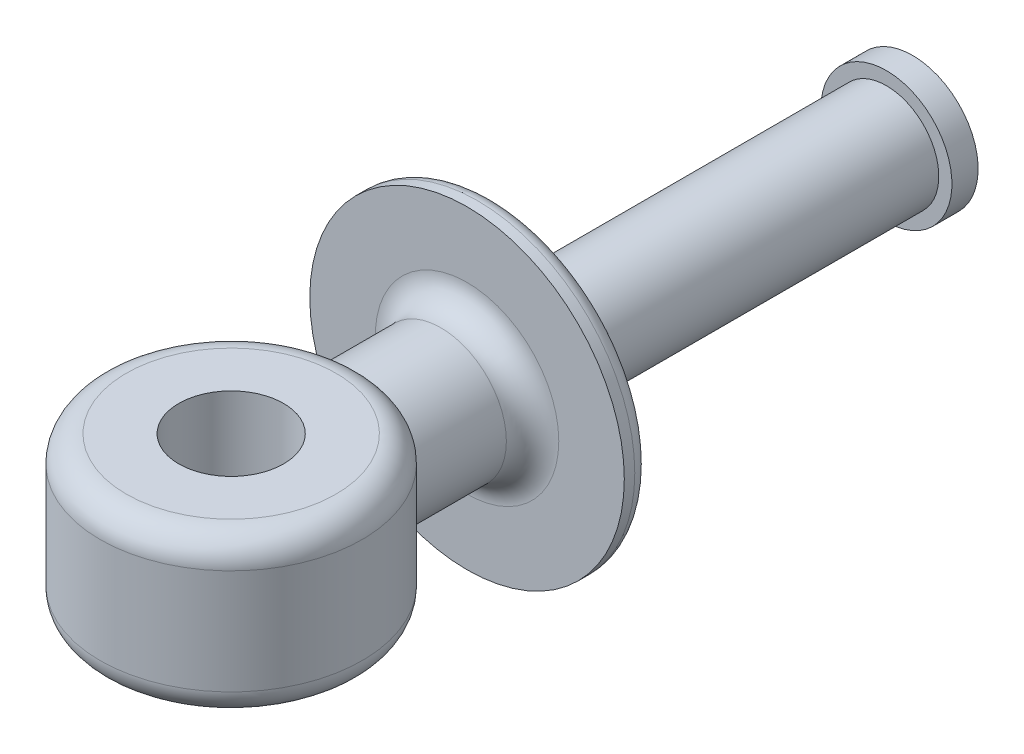
ISO-10303-21;
HEADER;
FILE_DESCRIPTION(('STEP AP214'),'2;1');
FILE_NAME('part.step','',(''),(''),'','','');
FILE_SCHEMA(('AUTOMOTIVE_DESIGN { 1 0 10303 214 1 1 1 1 }'));
ENDSEC;
DATA;
#1=APPLICATION_CONTEXT('core data for automotive mechanical design processes');
#2=APPLICATION_PROTOCOL_DEFINITION('international standard','automotive_design',2000,#1);
#3=PRODUCT_CONTEXT('',#1,'mechanical');
#4=PRODUCT('Part','Part','',(#3));
#5=PRODUCT_RELATED_PRODUCT_CATEGORY('part','',(#4));
#6=PRODUCT_DEFINITION_FORMATION('','',#4);
#7=PRODUCT_DEFINITION_CONTEXT('part definition',#1,'design');
#8=PRODUCT_DEFINITION('design','',#6,#7);
#9=PRODUCT_DEFINITION_SHAPE('','',#8);
#10=(LENGTH_UNIT() NAMED_UNIT(*) SI_UNIT(.MILLI.,.METRE.));
#11=(NAMED_UNIT(*) PLANE_ANGLE_UNIT() SI_UNIT($,.RADIAN.));
#12=(NAMED_UNIT(*) SI_UNIT($,.STERADIAN.) SOLID_ANGLE_UNIT());
#13=UNCERTAINTY_MEASURE_WITH_UNIT(LENGTH_MEASURE(1.E-05),#10,'distance_accuracy_value','');
#14=(GEOMETRIC_REPRESENTATION_CONTEXT(3) GLOBAL_UNCERTAINTY_ASSIGNED_CONTEXT((#13)) GLOBAL_UNIT_ASSIGNED_CONTEXT((#10,
#11,#12)) REPRESENTATION_CONTEXT('',''));
#15=CARTESIAN_POINT('',(0.,0.,0.));
#16=DIRECTION('',(0.,0.,1.));
#17=DIRECTION('',(1.,0.,0.));
#18=AXIS2_PLACEMENT_3D('',#15,#16,#17);
#19=CARTESIAN_POINT('',(0.,0.,40.));
#20=DIRECTION('',(0.,0.,1.));
#21=DIRECTION('',(1.,0.,0.));
#22=AXIS2_PLACEMENT_3D('',#19,#20,#21);
#23=PLANE('',#22);
#24=CARTESIAN_POINT('',(0.,0.,40.));
#25=DIRECTION('',(0.,0.,1.));
#26=DIRECTION('',(1.,0.,0.));
#27=AXIS2_PLACEMENT_3D('',#24,#25,#26);
#28=CIRCLE('',#27,8.75);
#29=CARTESIAN_POINT('',(8.75,0.,40.));
#30=VERTEX_POINT('',#29);
#31=EDGE_CURVE('E54',#30,#30,#28,.F.);
#32=ORIENTED_EDGE('',*,*,#31,.T.);
#33=EDGE_LOOP('',(#32));
#34=FACE_BOUND('',#33,.T.);
#35=CARTESIAN_POINT('',(0.,0.,40.));
#36=DIRECTION('',(0.,0.,1.));
#37=DIRECTION('',(1.,0.,0.));
#38=AXIS2_PLACEMENT_3D('',#35,#36,#37);
#39=CIRCLE('',#38,15.);
#40=CARTESIAN_POINT('',(15.,0.,40.));
#41=VERTEX_POINT('',#40);
#42=EDGE_CURVE('E73',#41,#41,#39,.T.);
#43=ORIENTED_EDGE('',*,*,#42,.T.);
#44=EDGE_LOOP('',(#43));
#45=FACE_BOUND('',#44,.T.);
#46=ADVANCED_FACE('F43',(#34,#45),#23,.T.);
#47=CARTESIAN_POINT('',(0.,0.,37.5));
#48=DIRECTION('',(0.,0.,-1.));
#49=DIRECTION('',(-1.,0.,0.));
#50=AXIS2_PLACEMENT_3D('',#47,#48,#49);
#51=CYLINDRICAL_SURFACE('',#50,5.);
#52=CARTESIAN_POINT('',(0.,0.,37.5));
#53=DIRECTION('',(0.,0.,1.));
#54=DIRECTION('',(1.,0.,0.));
#55=AXIS2_PLACEMENT_3D('',#52,#53,#54);
#56=CIRCLE('',#55,5.);
#57=CARTESIAN_POINT('',(5.,0.,37.5));
#58=VERTEX_POINT('',#57);
#59=EDGE_CURVE('E63',#58,#58,#56,.T.);
#60=ORIENTED_EDGE('',*,*,#59,.F.);
#61=EDGE_LOOP('',(#60));
#62=FACE_BOUND('',#61,.T.);
#63=CARTESIAN_POINT('',(0.,0.,0.));
#64=DIRECTION('',(0.,0.,-1.));
#65=DIRECTION('',(-1.,0.,0.));
#66=AXIS2_PLACEMENT_3D('',#63,#64,#65);
#67=CIRCLE('',#66,5.);
#68=CARTESIAN_POINT('',(-5.,0.,0.));
#69=VERTEX_POINT('',#68);
#70=EDGE_CURVE('E66',#69,#69,#67,.T.);
#71=ORIENTED_EDGE('',*,*,#70,.F.);
#72=EDGE_LOOP('',(#71));
#73=FACE_BOUND('',#72,.T.);
#74=ADVANCED_FACE('F99',(#62,#73),#51,.T.);
#75=CARTESIAN_POINT('',(0.,0.,0.));
#76=DIRECTION('',(0.,0.,-1.));
#77=DIRECTION('',(-1.,0.,0.));
#78=AXIS2_PLACEMENT_3D('',#75,#76,#77);
#79=PLANE('',#78);
#80=CARTESIAN_POINT('',(0.,0.,0.));
#81=DIRECTION('',(0.,0.,-1.));
#82=DIRECTION('',(-1.,0.,0.));
#83=AXIS2_PLACEMENT_3D('',#80,#81,#82);
#84=CIRCLE('',#83,6.25);
#85=CARTESIAN_POINT('',(-6.25,0.,0.));
#86=VERTEX_POINT('',#85);
#87=EDGE_CURVE('E70',#86,#86,#84,.T.);
#88=ORIENTED_EDGE('',*,*,#87,.F.);
#89=EDGE_LOOP('',(#88));
#90=FACE_BOUND('',#89,.T.);
#91=ORIENTED_EDGE('',*,*,#70,.T.);
#92=EDGE_LOOP('',(#91));
#93=FACE_BOUND('',#92,.T.);
#94=ADVANCED_FACE('F104',(#90,#93),#79,.F.);
#95=CARTESIAN_POINT('',(0.,0.,-2.5));
#96=DIRECTION('',(0.,0.,1.));
#97=DIRECTION('',(1.,0.,0.));
#98=AXIS2_PLACEMENT_3D('',#95,#96,#97);
#99=CYLINDRICAL_SURFACE('',#98,6.25);
#100=CARTESIAN_POINT('',(0.,0.,-2.5));
#101=DIRECTION('',(0.,0.,-1.));
#102=DIRECTION('',(-1.,0.,0.));
#103=AXIS2_PLACEMENT_3D('',#100,#101,#102);
#104=CIRCLE('',#103,6.25);
#105=CARTESIAN_POINT('',(-6.25,0.,-2.5));
#106=VERTEX_POINT('',#105);
#107=EDGE_CURVE('E69',#106,#106,#104,.T.);
#108=ORIENTED_EDGE('',*,*,#107,.F.);
#109=EDGE_LOOP('',(#108));
#110=FACE_BOUND('',#109,.T.);
#111=ORIENTED_EDGE('',*,*,#87,.T.);
#112=EDGE_LOOP('',(#111));
#113=FACE_BOUND('',#112,.T.);
#114=ADVANCED_FACE('F114',(#110,#113),#99,.T.);
#115=CARTESIAN_POINT('',(0.,0.,-2.5));
#116=DIRECTION('',(0.,0.,-1.));
#117=DIRECTION('',(-1.,0.,0.));
#118=AXIS2_PLACEMENT_3D('',#115,#116,#117);
#119=PLANE('',#118);
#120=ORIENTED_EDGE('',*,*,#107,.T.);
#121=EDGE_LOOP('',(#120));
#122=FACE_BOUND('',#121,.T.);
#123=ADVANCED_FACE('F110',(#122),#119,.T.);
#124=CARTESIAN_POINT('',(0.,0.,37.5));
#125=DIRECTION('',(0.,0.,1.));
#126=DIRECTION('',(1.,0.,0.));
#127=AXIS2_PLACEMENT_3D('',#124,#125,#126);
#128=PLANE('',#127);
#129=CARTESIAN_POINT('',(0.,0.,37.5));
#130=DIRECTION('',(0.,0.,1.));
#131=DIRECTION('',(1.,0.,0.));
#132=AXIS2_PLACEMENT_3D('',#129,#130,#131);
#133=CIRCLE('',#132,13.5);
#134=CARTESIAN_POINT('',(13.5,0.,37.5));
#135=VERTEX_POINT('',#134);
#136=EDGE_CURVE('E11',#135,#135,#133,.F.);
#137=ORIENTED_EDGE('',*,*,#136,.T.);
#138=EDGE_LOOP('',(#137));
#139=FACE_BOUND('',#138,.T.);
#140=ORIENTED_EDGE('',*,*,#59,.T.);
#141=EDGE_LOOP('',(#140));
#142=FACE_BOUND('',#141,.T.);
#143=ADVANCED_FACE('F95',(#139,#142),#128,.F.);
#144=CARTESIAN_POINT('',(0.,0.,40.));
#145=DIRECTION('',(0.,0.,-1.));
#146=DIRECTION('',(-1.,0.,0.));
#147=AXIS2_PLACEMENT_3D('',#144,#145,#146);
#148=CYLINDRICAL_SURFACE('',#147,15.);
#149=CARTESIAN_POINT('',(0.,0.,39.));
#150=DIRECTION('',(0.,0.,1.));
#151=DIRECTION('',(1.,0.,0.));
#152=AXIS2_PLACEMENT_3D('',#149,#150,#151);
#153=CIRCLE('',#152,15.);
#154=CARTESIAN_POINT('',(15.,0.,39.));
#155=VERTEX_POINT('',#154);
#156=EDGE_CURVE('E50',#155,#155,#153,.T.);
#157=ORIENTED_EDGE('',*,*,#156,.T.);
#158=EDGE_LOOP('',(#157));
#159=FACE_BOUND('',#158,.T.);
#160=ORIENTED_EDGE('',*,*,#42,.F.);
#161=EDGE_LOOP('',(#160));
#162=FACE_BOUND('',#161,.T.);
#163=ADVANCED_FACE('F86',(#159,#162),#148,.T.);
#164=CARTESIAN_POINT('',(0.,0.,55.));
#165=DIRECTION('',(0.,0.,-1.));
#166=DIRECTION('',(-1.,0.,0.));
#167=AXIS2_PLACEMENT_3D('',#164,#165,#166);
#168=CYLINDRICAL_SURFACE('',#167,6.25);
#169=CARTESIAN_POINT('',(0.,0.,42.5));
#170=DIRECTION('',(0.,0.,1.));
#171=DIRECTION('',(1.,0.,0.));
#172=AXIS2_PLACEMENT_3D('',#169,#170,#171);
#173=CIRCLE('',#172,6.25);
#174=CARTESIAN_POINT('',(6.25,0.,42.5));
#175=VERTEX_POINT('',#174);
#176=EDGE_CURVE('E58',#175,#175,#173,.T.);
#177=ORIENTED_EDGE('',*,*,#176,.T.);
#178=EDGE_LOOP('',(#177));
#179=FACE_BOUND('',#178,.T.);
#180=CARTESIAN_POINT('',(0.,0.,55.));
#181=DIRECTION('',(0.,0.,1.));
#182=DIRECTION('',(1.,0.,0.));
#183=AXIS2_PLACEMENT_3D('',#180,#181,#182);
#184=CIRCLE('',#183,6.25);
#185=CARTESIAN_POINT('',(6.25,0.,55.));
#186=VERTEX_POINT('',#185);
#187=EDGE_CURVE('E78',#186,#186,#184,.T.);
#188=ORIENTED_EDGE('',*,*,#187,.F.);
#189=EDGE_LOOP('',(#188));
#190=FACE_BOUND('',#189,.T.);
#191=ADVANCED_FACE('F84',(#179,#190),#168,.T.);
#192=CARTESIAN_POINT('',(0.,0.,55.));
#193=DIRECTION('',(0.,0.,1.));
#194=DIRECTION('',(1.,0.,0.));
#195=AXIS2_PLACEMENT_3D('',#192,#193,#194);
#196=PLANE('',#195);
#197=ORIENTED_EDGE('',*,*,#187,.T.);
#198=EDGE_LOOP('',(#197));
#199=FACE_BOUND('',#198,.T.);
#200=ADVANCED_FACE('F82',(#199),#196,.T.);
#201=CARTESIAN_POINT('',(0.,0.,42.5));
#202=DIRECTION('',(0.,0.,1.));
#203=DIRECTION('',(1.,0.,0.));
#204=AXIS2_PLACEMENT_3D('',#201,#202,#203);
#205=TOROIDAL_SURFACE('',#204,8.75,2.5);
#206=ORIENTED_EDGE('',*,*,#31,.F.);
#207=EDGE_LOOP('',(#206));
#208=FACE_BOUND('',#207,.T.);
#209=ORIENTED_EDGE('',*,*,#176,.F.);
#210=EDGE_LOOP('',(#209));
#211=FACE_BOUND('',#210,.T.);
#212=ADVANCED_FACE('F93',(#208,#211),#205,.F.);
#213=CARTESIAN_POINT('',(0.,0.,39.));
#214=DIRECTION('',(0.,0.,1.));
#215=DIRECTION('',(1.,0.,0.));
#216=AXIS2_PLACEMENT_3D('',#213,#214,#215);
#217=TOROIDAL_SURFACE('',#216,13.5,1.5);
#218=ORIENTED_EDGE('',*,*,#136,.F.);
#219=EDGE_LOOP('',(#218));
#220=FACE_BOUND('',#219,.T.);
#221=ORIENTED_EDGE('',*,*,#156,.F.);
#222=EDGE_LOOP('',(#221));
#223=FACE_BOUND('',#222,.T.);
#224=ADVANCED_FACE('F45',(#220,#223),#217,.T.);
#225=CLOSED_SHELL('',(#46,#74,#94,#114,#123,#143,#163,#191,#200,#212,#224));
#226=MANIFOLD_SOLID_BREP('B2',#225);
#227=CARTESIAN_POINT('',(0.,7.5,62.5));
#228=DIRECTION('',(0.,-1.,0.));
#229=DIRECTION('',(0.,0.,-1.));
#230=AXIS2_PLACEMENT_3D('',#227,#228,#229);
#231=CYLINDRICAL_SURFACE('',#230,12.5);
#232=CARTESIAN_POINT('',(0.,-5.,62.5));
#233=DIRECTION('',(0.,1.,0.));
#234=DIRECTION('',(0.,0.,1.));
#235=AXIS2_PLACEMENT_3D('',#232,#233,#234);
#236=CIRCLE('',#235,12.5);
#237=CARTESIAN_POINT('',(0.,-5.,75.));
#238=VERTEX_POINT('',#237);
#239=EDGE_CURVE('E233',#238,#238,#236,.T.);
#240=ORIENTED_EDGE('',*,*,#239,.T.);
#241=EDGE_LOOP('',(#240));
#242=FACE_BOUND('',#241,.T.);
#243=CARTESIAN_POINT('',(0.,5.,62.5));
#244=DIRECTION('',(0.,1.,0.));
#245=DIRECTION('',(0.,0.,1.));
#246=AXIS2_PLACEMENT_3D('',#243,#244,#245);
#247=CIRCLE('',#246,12.5);
#248=CARTESIAN_POINT('',(0.,5.,75.));
#249=VERTEX_POINT('',#248);
#250=EDGE_CURVE('E237',#249,#249,#247,.F.);
#251=ORIENTED_EDGE('',*,*,#250,.T.);
#252=EDGE_LOOP('',(#251));
#253=FACE_BOUND('',#252,.T.);
#254=ADVANCED_FACE('F222',(#242,#253),#231,.T.);
#255=CARTESIAN_POINT('',(0.,7.5,62.5));
#256=DIRECTION('',(0.,1.,0.));
#257=DIRECTION('',(0.,0.,1.));
#258=AXIS2_PLACEMENT_3D('',#255,#256,#257);
#259=PLANE('',#258);
#260=CARTESIAN_POINT('',(0.,7.5,62.5));
#261=DIRECTION('',(0.,1.,0.));
#262=DIRECTION('',(0.,0.,1.));
#263=AXIS2_PLACEMENT_3D('',#260,#261,#262);
#264=CIRCLE('',#263,10.);
#265=CARTESIAN_POINT('',(0.,7.5,72.5));
#266=VERTEX_POINT('',#265);
#267=EDGE_CURVE('E42',#266,#266,#264,.T.);
#268=ORIENTED_EDGE('',*,*,#267,.T.);
#269=EDGE_LOOP('',(#268));
#270=FACE_BOUND('',#269,.T.);
#271=CARTESIAN_POINT('',(0.,7.5,62.5));
#272=DIRECTION('',(0.,1.,0.));
#273=DIRECTION('',(0.,0.,1.));
#274=AXIS2_PLACEMENT_3D('',#271,#272,#273);
#275=CIRCLE('',#274,5.);
#276=CARTESIAN_POINT('',(0.,7.5,67.5));
#277=VERTEX_POINT('',#276);
#278=EDGE_CURVE('E245',#277,#277,#275,.T.);
#279=ORIENTED_EDGE('',*,*,#278,.F.);
#280=EDGE_LOOP('',(#279));
#281=FACE_BOUND('',#280,.T.);
#282=ADVANCED_FACE('F252',(#270,#281),#259,.T.);
#283=CARTESIAN_POINT('',(0.,-7.5,62.5));
#284=DIRECTION('',(0.,1.,0.));
#285=DIRECTION('',(0.,0.,1.));
#286=AXIS2_PLACEMENT_3D('',#283,#284,#285);
#287=PLANE('',#286);
#288=CARTESIAN_POINT('',(0.,-7.5,62.5));
#289=DIRECTION('',(0.,1.,0.));
#290=DIRECTION('',(0.,0.,1.));
#291=AXIS2_PLACEMENT_3D('',#288,#289,#290);
#292=CIRCLE('',#291,10.);
#293=CARTESIAN_POINT('',(0.,-7.5,72.5));
#294=VERTEX_POINT('',#293);
#295=EDGE_CURVE('E229',#294,#294,#292,.F.);
#296=ORIENTED_EDGE('',*,*,#295,.T.);
#297=EDGE_LOOP('',(#296));
#298=FACE_BOUND('',#297,.T.);
#299=CARTESIAN_POINT('',(0.,-7.5,62.5));
#300=DIRECTION('',(0.,1.,0.));
#301=DIRECTION('',(0.,0.,1.));
#302=AXIS2_PLACEMENT_3D('',#299,#300,#301);
#303=CIRCLE('',#302,5.);
#304=CARTESIAN_POINT('',(0.,-7.5,67.5));
#305=VERTEX_POINT('',#304);
#306=EDGE_CURVE('E242',#305,#305,#303,.T.);
#307=ORIENTED_EDGE('',*,*,#306,.T.);
#308=EDGE_LOOP('',(#307));
#309=FACE_BOUND('',#308,.T.);
#310=ADVANCED_FACE('F254',(#298,#309),#287,.F.);
#311=CARTESIAN_POINT('',(0.,-15.,62.5));
#312=DIRECTION('',(0.,1.,0.));
#313=DIRECTION('',(0.,0.,1.));
#314=AXIS2_PLACEMENT_3D('',#311,#312,#313);
#315=CYLINDRICAL_SURFACE('',#314,5.);
#316=CARTESIAN_POINT('',(0.,7.5,67.5));
#317=CARTESIAN_POINT('',(0.,7.34375,67.5));
#318=CARTESIAN_POINT('',(0.,7.1875,67.5));
#319=CARTESIAN_POINT('',(0.,6.875,67.5));
#320=CARTESIAN_POINT('',(0.,6.71875,67.5));
#321=CARTESIAN_POINT('',(0.,6.40625,67.5));
#322=CARTESIAN_POINT('',(0.,6.25,67.5));
#323=CARTESIAN_POINT('',(0.,5.93749999999999,67.5));
#324=CARTESIAN_POINT('',(0.,5.78124999999999,67.5));
#325=CARTESIAN_POINT('',(0.,5.46875,67.5));
#326=CARTESIAN_POINT('',(0.,5.3125,67.5));
#327=CARTESIAN_POINT('',(0.,5.,67.5));
#328=CARTESIAN_POINT('',(0.,4.84375,67.5));
#329=CARTESIAN_POINT('',(0.,4.53125,67.5));
#330=CARTESIAN_POINT('',(0.,4.375,67.5));
#331=CARTESIAN_POINT('',(0.,4.0625,67.5));
#332=CARTESIAN_POINT('',(0.,3.90625,67.5));
#333=CARTESIAN_POINT('',(0.,3.59375,67.5));
#334=CARTESIAN_POINT('',(0.,3.4375,67.5));
#335=CARTESIAN_POINT('',(0.,3.125,67.5));
#336=CARTESIAN_POINT('',(0.,2.96875,67.5));
#337=CARTESIAN_POINT('',(0.,2.65625,67.5));
#338=CARTESIAN_POINT('',(0.,2.5,67.5));
#339=CARTESIAN_POINT('',(0.,2.1875,67.5));
#340=CARTESIAN_POINT('',(0.,2.03125,67.5));
#341=CARTESIAN_POINT('',(0.,1.71875,67.5));
#342=CARTESIAN_POINT('',(0.,1.5625,67.5));
#343=CARTESIAN_POINT('',(0.,1.25,67.5));
#344=CARTESIAN_POINT('',(0.,1.09375,67.5));
#345=CARTESIAN_POINT('',(0.,0.781249999999998,67.5));
#346=CARTESIAN_POINT('',(0.,0.624999999999998,67.5));
#347=CARTESIAN_POINT('',(0.,0.312499999999999,67.5));
#348=CARTESIAN_POINT('',(0.,0.156249999999998,67.5));
#349=CARTESIAN_POINT('',(0.,-0.156250000000002,67.5));
#350=CARTESIAN_POINT('',(0.,-0.312500000000002,67.5));
#351=CARTESIAN_POINT('',(0.,-0.625000000000002,67.5));
#352=CARTESIAN_POINT('',(0.,-0.781250000000002,67.5));
#353=CARTESIAN_POINT('',(0.,-1.09375,67.5));
#354=CARTESIAN_POINT('',(0.,-1.25,67.5));
#355=CARTESIAN_POINT('',(0.,-1.5625,67.5));
#356=CARTESIAN_POINT('',(0.,-1.71875,67.5));
#357=CARTESIAN_POINT('',(0.,-2.03125,67.5));
#358=CARTESIAN_POINT('',(0.,-2.1875,67.5));
#359=CARTESIAN_POINT('',(0.,-2.5,67.5));
#360=CARTESIAN_POINT('',(0.,-2.65625,67.5));
#361=CARTESIAN_POINT('',(0.,-2.96875,67.5));
#362=CARTESIAN_POINT('',(0.,-3.125,67.5));
#363=CARTESIAN_POINT('',(0.,-3.4375,67.5));
#364=CARTESIAN_POINT('',(0.,-3.59375,67.5));
#365=CARTESIAN_POINT('',(0.,-3.90625,67.5));
#366=CARTESIAN_POINT('',(0.,-4.0625,67.5));
#367=CARTESIAN_POINT('',(0.,-4.375,67.5));
#368=CARTESIAN_POINT('',(0.,-4.53125,67.5));
#369=CARTESIAN_POINT('',(0.,-4.84375,67.5));
#370=CARTESIAN_POINT('',(0.,-5.,67.5));
#371=CARTESIAN_POINT('',(0.,-5.3125,67.5));
#372=CARTESIAN_POINT('',(0.,-5.46875,67.5));
#373=CARTESIAN_POINT('',(0.,-5.78125,67.5));
#374=CARTESIAN_POINT('',(0.,-5.9375,67.5));
#375=CARTESIAN_POINT('',(0.,-6.25,67.5));
#376=CARTESIAN_POINT('',(0.,-6.40625,67.5));
#377=CARTESIAN_POINT('',(0.,-6.71875,67.5));
#378=CARTESIAN_POINT('',(0.,-6.875,67.5));
#379=CARTESIAN_POINT('',(0.,-7.1875,67.5));
#380=CARTESIAN_POINT('',(0.,-7.34375,67.5));
#381=CARTESIAN_POINT('',(0.,-7.5,67.5));
#382=B_SPLINE_CURVE_WITH_KNOTS('',3,(#316,#317,#318,#319,#320,#321,#322,#323,#324,#325,#326,
#327,#328,#329,#330,#331,#332,#333,#334,#335,#336,#337,#338,#339,#340,#341,#342,#343,#344,#345,
#346,#347,#348,#349,#350,#351,#352,#353,#354,#355,#356,#357,#358,#359,#360,#361,#362,#363,#364,
#365,#366,#367,#368,#369,#370,#371,#372,#373,#374,#375,#376,#377,#378,#379,#380,#381),
.UNSPECIFIED.,.F.,.F.,(4,2,2,2,2,2,2,2,2,2,2,2,2,2,2,2,2,2,2,2,2,2,2,2,2,2,2,2,2,2,2,2,4),(0.,
0.46875,0.937500000000001,1.40625,1.875,2.34375,2.8125,3.28125,3.75,4.21875,4.6875,5.15625,
5.625,6.09375,6.5625,7.03125,7.5,7.96875,8.4375,8.90625,9.375,9.84375,10.3125,10.78125,11.25,
11.71875,12.1875,12.65625,13.125,13.59375,14.0625,14.53125,15.),.UNSPECIFIED.);
#383=EDGE_CURVE('BSEAM249',#277,#305,#382,.T.);
#384=ORIENTED_EDGE('',*,*,#278,.T.);
#385=ORIENTED_EDGE('',*,*,#306,.F.);
#386=ORIENTED_EDGE('',*,*,#383,.T.);
#387=ORIENTED_EDGE('',*,*,#383,.F.);
#388=EDGE_LOOP('',(#384,#386,#385,#387));
#389=FACE_BOUND('',#388,.T.);
#390=ADVANCED_FACE('F249',(#389),#315,.F.);
#391=CARTESIAN_POINT('',(0.,-5.,62.5));
#392=DIRECTION('',(0.,1.,0.));
#393=DIRECTION('',(0.,0.,1.));
#394=AXIS2_PLACEMENT_3D('',#391,#392,#393);
#395=TOROIDAL_SURFACE('',#394,10.,2.5);
#396=ORIENTED_EDGE('',*,*,#295,.F.);
#397=EDGE_LOOP('',(#396));
#398=FACE_BOUND('',#397,.T.);
#399=ORIENTED_EDGE('',*,*,#239,.F.);
#400=EDGE_LOOP('',(#399));
#401=FACE_BOUND('',#400,.T.);
#402=ADVANCED_FACE('F264',(#398,#401),#395,.T.);
#403=CARTESIAN_POINT('',(0.,5.,62.5));
#404=DIRECTION('',(0.,1.,0.));
#405=DIRECTION('',(0.,0.,1.));
#406=AXIS2_PLACEMENT_3D('',#403,#404,#405);
#407=TOROIDAL_SURFACE('',#406,10.,2.5);
#408=ORIENTED_EDGE('',*,*,#250,.F.);
#409=EDGE_LOOP('',(#408));
#410=FACE_BOUND('',#409,.T.);
#411=ORIENTED_EDGE('',*,*,#267,.F.);
#412=EDGE_LOOP('',(#411));
#413=FACE_BOUND('',#412,.T.);
#414=ADVANCED_FACE('F224',(#410,#413),#407,.T.);
#415=CLOSED_SHELL('',(#254,#282,#310,#390,#402,#414));
#416=MANIFOLD_SOLID_BREP('B6',#415);
#417=ADVANCED_BREP_SHAPE_REPRESENTATION('',(#18,#226,#416),#14);
#418=SHAPE_DEFINITION_REPRESENTATION(#9,#417);
ENDSEC;
END-ISO-10303-21;
